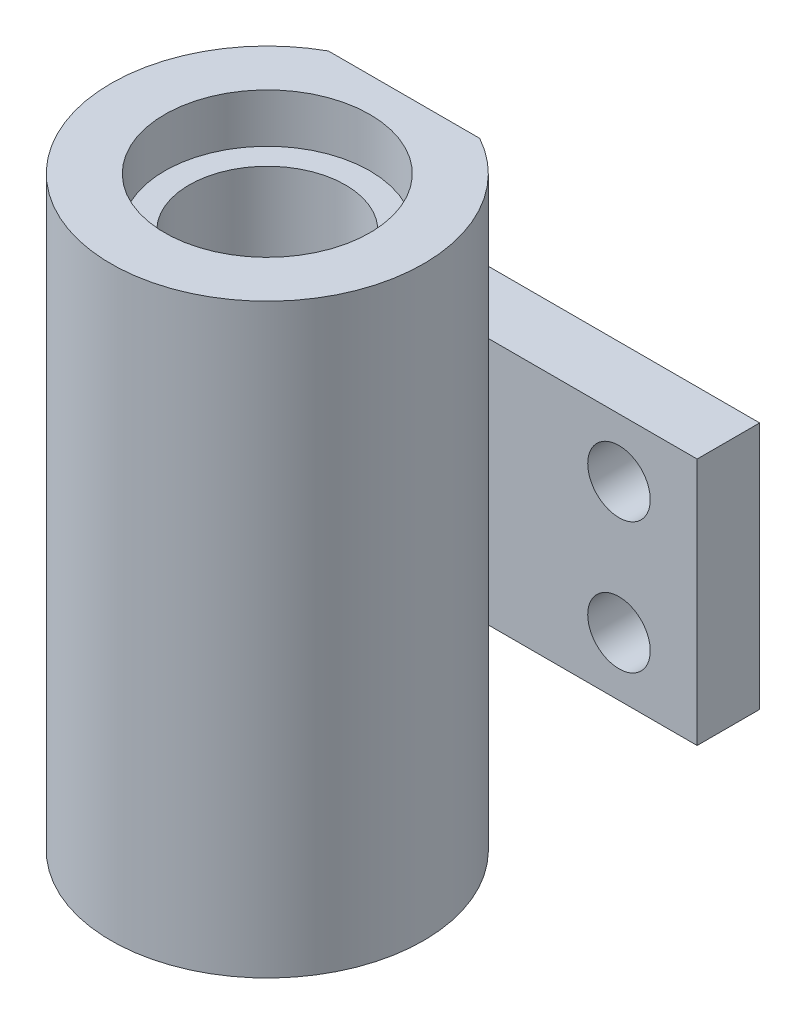
ISO-10303-21;
HEADER;
FILE_DESCRIPTION(('STEP AP214'),'2;1');
FILE_NAME('part.step','',(''),(''),'','','');
FILE_SCHEMA(('AUTOMOTIVE_DESIGN { 1 0 10303 214 1 1 1 1 }'));
ENDSEC;
DATA;
#1=APPLICATION_CONTEXT('core data for automotive mechanical design processes');
#2=APPLICATION_PROTOCOL_DEFINITION('international standard','automotive_design',2000,#1);
#3=PRODUCT_CONTEXT('',#1,'mechanical');
#4=PRODUCT('Part','Part','',(#3));
#5=PRODUCT_RELATED_PRODUCT_CATEGORY('part','',(#4));
#6=PRODUCT_DEFINITION_FORMATION('','',#4);
#7=PRODUCT_DEFINITION_CONTEXT('part definition',#1,'design');
#8=PRODUCT_DEFINITION('design','',#6,#7);
#9=PRODUCT_DEFINITION_SHAPE('','',#8);
#10=(LENGTH_UNIT() NAMED_UNIT(*) SI_UNIT(.MILLI.,.METRE.));
#11=(NAMED_UNIT(*) PLANE_ANGLE_UNIT() SI_UNIT($,.RADIAN.));
#12=(NAMED_UNIT(*) SI_UNIT($,.STERADIAN.) SOLID_ANGLE_UNIT());
#13=UNCERTAINTY_MEASURE_WITH_UNIT(LENGTH_MEASURE(1.E-05),#10,'distance_accuracy_value','');
#14=(GEOMETRIC_REPRESENTATION_CONTEXT(3) GLOBAL_UNCERTAINTY_ASSIGNED_CONTEXT((#13)) GLOBAL_UNIT_ASSIGNED_CONTEXT((#10,
#11,#12)) REPRESENTATION_CONTEXT('',''));
#15=CARTESIAN_POINT('',(0.,0.,0.));
#16=DIRECTION('',(0.,0.,1.));
#17=DIRECTION('',(1.,0.,0.));
#18=AXIS2_PLACEMENT_3D('',#15,#16,#17);
#19=CARTESIAN_POINT('',(-15.,64.,-14.));
#20=DIRECTION('',(0.,0.,1.));
#21=DIRECTION('',(1.,0.,0.));
#22=AXIS2_PLACEMENT_3D('',#19,#20,#21);
#23=PLANE('',#22);
#24=DIRECTION('',(1.,0.,0.));
#25=VECTOR('',#24,1.);
#26=CARTESIAN_POINT('',(-15.,42.7,-14.));
#27=LINE('',#26,#25);
#28=CARTESIAN_POINT('',(-7.74596669241483,42.7,-14.));
#29=VERTEX_POINT('',#28);
#30=CARTESIAN_POINT('',(7.74596669241483,42.7,-14.));
#31=VERTEX_POINT('',#30);
#32=EDGE_CURVE('E11',#29,#31,#27,.T.);
#33=ORIENTED_EDGE('',*,*,#32,.F.);
#34=DIRECTION('',(0.,-1.,0.));
#35=VECTOR('',#34,1.);
#36=CARTESIAN_POINT('',(-7.74596669241483,0.,-14.));
#37=LINE('',#36,#35);
#38=CARTESIAN_POINT('',(-7.74596669241483,60.,-14.));
#39=VERTEX_POINT('',#38);
#40=EDGE_CURVE('E136',#39,#29,#37,.T.);
#41=ORIENTED_EDGE('',*,*,#40,.F.);
#42=DIRECTION('',(-1.,0.,0.));
#43=VECTOR('',#42,1.);
#44=CARTESIAN_POINT('',(-10.5,60.,-14.));
#45=LINE('',#44,#43);
#46=CARTESIAN_POINT('',(7.74596669241483,60.,-14.));
#47=VERTEX_POINT('',#46);
#48=EDGE_CURVE('E132',#47,#39,#45,.T.);
#49=ORIENTED_EDGE('',*,*,#48,.F.);
#50=DIRECTION('',(0.,-1.,0.));
#51=VECTOR('',#50,1.);
#52=CARTESIAN_POINT('',(7.74596669241483,0.,-14.));
#53=LINE('',#52,#51);
#54=EDGE_CURVE('E52',#31,#47,#53,.F.);
#55=ORIENTED_EDGE('',*,*,#54,.F.);
#56=EDGE_LOOP('',(#33,#41,#49,#55));
#57=FACE_BOUND('',#56,.T.);
#58=ADVANCED_FACE('F34',(#57),#23,.F.);
#59=DIRECTION('',(-1.,0.,0.));
#60=VECTOR('',#59,1.);
#61=CARTESIAN_POINT('',(-15.,17.3,-14.));
#62=LINE('',#61,#60);
#63=CARTESIAN_POINT('',(7.74596669241483,17.3,-14.));
#64=VERTEX_POINT('',#63);
#65=CARTESIAN_POINT('',(-7.74596669241483,17.3,-14.));
#66=VERTEX_POINT('',#65);
#67=EDGE_CURVE('E42',#64,#66,#62,.T.);
#68=ORIENTED_EDGE('',*,*,#67,.F.);
#69=CARTESIAN_POINT('',(7.74596669241482,0.,-14.));
#70=VERTEX_POINT('',#69);
#71=EDGE_CURVE('E126',#70,#64,#53,.F.);
#72=ORIENTED_EDGE('',*,*,#71,.F.);
#73=DIRECTION('',(1.,0.,0.));
#74=VECTOR('',#73,1.);
#75=CARTESIAN_POINT('',(-16.,0.,-14.));
#76=LINE('',#75,#74);
#77=CARTESIAN_POINT('',(-7.74596669241482,0.,-14.));
#78=VERTEX_POINT('',#77);
#79=EDGE_CURVE('E163',#78,#70,#76,.T.);
#80=ORIENTED_EDGE('',*,*,#79,.F.);
#81=EDGE_CURVE('E135',#66,#78,#37,.T.);
#82=ORIENTED_EDGE('',*,*,#81,.F.);
#83=EDGE_LOOP('',(#68,#72,#80,#82));
#84=FACE_BOUND('',#83,.T.);
#85=ADVANCED_FACE('F175',(#84),#23,.F.);
#86=CARTESIAN_POINT('',(0.,0.,0.));
#87=DIRECTION('',(0.,-1.,0.));
#88=DIRECTION('',(0.,0.,-1.));
#89=AXIS2_PLACEMENT_3D('',#86,#87,#88);
#90=CYLINDRICAL_SURFACE('',#89,8.);
#91=CARTESIAN_POINT('',(0.,55.,0.));
#92=DIRECTION('',(0.,-1.,0.));
#93=DIRECTION('',(0.,0.,-1.));
#94=AXIS2_PLACEMENT_3D('',#91,#92,#93);
#95=CIRCLE('',#94,8.);
#96=CARTESIAN_POINT('',(0.,55.,-8.));
#97=VERTEX_POINT('',#96);
#98=EDGE_CURVE('E160',#97,#97,#95,.T.);
#99=ORIENTED_EDGE('',*,*,#98,.F.);
#100=EDGE_LOOP('',(#99));
#101=FACE_BOUND('',#100,.T.);
#102=CARTESIAN_POINT('',(0.,5.,0.));
#103=DIRECTION('',(0.,-1.,0.));
#104=DIRECTION('',(0.,0.,-1.));
#105=AXIS2_PLACEMENT_3D('',#102,#103,#104);
#106=CIRCLE('',#105,8.);
#107=CARTESIAN_POINT('',(0.,5.,-8.));
#108=VERTEX_POINT('',#107);
#109=EDGE_CURVE('E138',#108,#108,#106,.T.);
#110=ORIENTED_EDGE('',*,*,#109,.T.);
#111=EDGE_LOOP('',(#110));
#112=FACE_BOUND('',#111,.T.);
#113=ADVANCED_FACE('F36',(#101,#112),#90,.F.);
#114=CARTESIAN_POINT('',(-8.,55.,0.));
#115=DIRECTION('',(0.,-1.,0.));
#116=DIRECTION('',(0.,0.,-1.));
#117=AXIS2_PLACEMENT_3D('',#114,#115,#116);
#118=PLANE('',#117);
#119=CARTESIAN_POINT('',(0.,55.,0.));
#120=DIRECTION('',(0.,-1.,0.));
#121=DIRECTION('',(0.,0.,-1.));
#122=AXIS2_PLACEMENT_3D('',#119,#120,#121);
#123=CIRCLE('',#122,10.5);
#124=CARTESIAN_POINT('',(0.,55.,-10.5));
#125=VERTEX_POINT('',#124);
#126=EDGE_CURVE('E157',#125,#125,#123,.T.);
#127=ORIENTED_EDGE('',*,*,#126,.F.);
#128=EDGE_LOOP('',(#127));
#129=FACE_BOUND('',#128,.T.);
#130=ORIENTED_EDGE('',*,*,#98,.T.);
#131=EDGE_LOOP('',(#130));
#132=FACE_BOUND('',#131,.T.);
#133=ADVANCED_FACE('F268',(#129,#132),#118,.F.);
#134=CARTESIAN_POINT('',(0.,0.,0.));
#135=DIRECTION('',(0.,-1.,0.));
#136=DIRECTION('',(0.,0.,-1.));
#137=AXIS2_PLACEMENT_3D('',#134,#135,#136);
#138=CYLINDRICAL_SURFACE('',#137,10.5);
#139=CARTESIAN_POINT('',(0.,60.,0.));
#140=DIRECTION('',(0.,-1.,0.));
#141=DIRECTION('',(0.,0.,-1.));
#142=AXIS2_PLACEMENT_3D('',#139,#140,#141);
#143=CIRCLE('',#142,10.5);
#144=CARTESIAN_POINT('',(0.,60.,-10.5));
#145=VERTEX_POINT('',#144);
#146=EDGE_CURVE('E154',#145,#145,#143,.T.);
#147=ORIENTED_EDGE('',*,*,#146,.F.);
#148=EDGE_LOOP('',(#147));
#149=FACE_BOUND('',#148,.T.);
#150=ORIENTED_EDGE('',*,*,#126,.T.);
#151=EDGE_LOOP('',(#150));
#152=FACE_BOUND('',#151,.T.);
#153=ADVANCED_FACE('F265',(#149,#152),#138,.F.);
#154=CARTESIAN_POINT('',(-10.5,60.,0.));
#155=DIRECTION('',(0.,-1.,0.));
#156=DIRECTION('',(0.,0.,-1.));
#157=AXIS2_PLACEMENT_3D('',#154,#155,#156);
#158=PLANE('',#157);
#159=CARTESIAN_POINT('',(0.,60.,0.));
#160=DIRECTION('',(0.,-1.,0.));
#161=DIRECTION('',(0.,0.,-1.));
#162=AXIS2_PLACEMENT_3D('',#159,#160,#161);
#163=CIRCLE('',#162,16.);
#164=EDGE_CURVE('E151',#47,#39,#163,.T.);
#165=ORIENTED_EDGE('',*,*,#164,.F.);
#166=ORIENTED_EDGE('',*,*,#48,.T.);
#167=EDGE_LOOP('',(#165,#166));
#168=FACE_BOUND('',#167,.T.);
#169=ORIENTED_EDGE('',*,*,#146,.T.);
#170=EDGE_LOOP('',(#169));
#171=FACE_BOUND('',#170,.T.);
#172=ADVANCED_FACE('F262',(#168,#171),#158,.F.);
#173=CARTESIAN_POINT('',(0.,0.,0.));
#174=DIRECTION('',(0.,-1.,0.));
#175=DIRECTION('',(0.,0.,-1.));
#176=AXIS2_PLACEMENT_3D('',#173,#174,#175);
#177=CYLINDRICAL_SURFACE('',#176,16.);
#178=ORIENTED_EDGE('',*,*,#164,.T.);
#179=ORIENTED_EDGE('',*,*,#40,.T.);
#180=EDGE_CURVE('E139',#29,#66,#37,.T.);
#181=ORIENTED_EDGE('',*,*,#180,.T.);
#182=ORIENTED_EDGE('',*,*,#81,.T.);
#183=CARTESIAN_POINT('',(0.,0.,0.));
#184=DIRECTION('',(0.,-1.,0.));
#185=DIRECTION('',(0.,0.,-1.));
#186=AXIS2_PLACEMENT_3D('',#183,#184,#185);
#187=CIRCLE('',#186,16.);
#188=EDGE_CURVE('E148',#70,#78,#187,.T.);
#189=ORIENTED_EDGE('',*,*,#188,.F.);
#190=ORIENTED_EDGE('',*,*,#71,.T.);
#191=EDGE_CURVE('E124',#64,#31,#53,.F.);
#192=ORIENTED_EDGE('',*,*,#191,.T.);
#193=ORIENTED_EDGE('',*,*,#54,.T.);
#194=EDGE_LOOP('',(#178,#179,#181,#182,#189,#190,#192,#193));
#195=FACE_BOUND('',#194,.T.);
#196=ADVANCED_FACE('F180',(#195),#177,.T.);
#197=CARTESIAN_POINT('',(-16.,0.,0.));
#198=DIRECTION('',(0.,1.,0.));
#199=DIRECTION('',(0.,0.,1.));
#200=AXIS2_PLACEMENT_3D('',#197,#198,#199);
#201=PLANE('',#200);
#202=CARTESIAN_POINT('',(0.,0.,0.));
#203=DIRECTION('',(0.,-1.,0.));
#204=DIRECTION('',(0.,0.,-1.));
#205=AXIS2_PLACEMENT_3D('',#202,#203,#204);
#206=CIRCLE('',#205,10.5);
#207=CARTESIAN_POINT('',(0.,0.,-10.5));
#208=VERTEX_POINT('',#207);
#209=EDGE_CURVE('E145',#208,#208,#206,.T.);
#210=ORIENTED_EDGE('',*,*,#209,.F.);
#211=EDGE_LOOP('',(#210));
#212=FACE_BOUND('',#211,.T.);
#213=ORIENTED_EDGE('',*,*,#188,.T.);
#214=ORIENTED_EDGE('',*,*,#79,.T.);
#215=EDGE_LOOP('',(#213,#214));
#216=FACE_BOUND('',#215,.T.);
#217=ADVANCED_FACE('F255',(#212,#216),#201,.F.);
#218=CARTESIAN_POINT('',(0.,0.,0.));
#219=DIRECTION('',(0.,-1.,0.));
#220=DIRECTION('',(0.,0.,-1.));
#221=AXIS2_PLACEMENT_3D('',#218,#219,#220);
#222=CYLINDRICAL_SURFACE('',#221,10.5);
#223=CARTESIAN_POINT('',(0.,5.,0.));
#224=DIRECTION('',(0.,-1.,0.));
#225=DIRECTION('',(0.,0.,-1.));
#226=AXIS2_PLACEMENT_3D('',#223,#224,#225);
#227=CIRCLE('',#226,10.5);
#228=CARTESIAN_POINT('',(0.,5.,-10.5));
#229=VERTEX_POINT('',#228);
#230=EDGE_CURVE('E142',#229,#229,#227,.T.);
#231=ORIENTED_EDGE('',*,*,#230,.F.);
#232=EDGE_LOOP('',(#231));
#233=FACE_BOUND('',#232,.T.);
#234=ORIENTED_EDGE('',*,*,#209,.T.);
#235=EDGE_LOOP('',(#234));
#236=FACE_BOUND('',#235,.T.);
#237=ADVANCED_FACE('F251',(#233,#236),#222,.F.);
#238=CARTESIAN_POINT('',(-10.5,5.,0.));
#239=DIRECTION('',(0.,1.,0.));
#240=DIRECTION('',(0.,0.,1.));
#241=AXIS2_PLACEMENT_3D('',#238,#239,#240);
#242=PLANE('',#241);
#243=ORIENTED_EDGE('',*,*,#109,.F.);
#244=EDGE_LOOP('',(#243));
#245=FACE_BOUND('',#244,.T.);
#246=ORIENTED_EDGE('',*,*,#230,.T.);
#247=EDGE_LOOP('',(#246));
#248=FACE_BOUND('',#247,.T.);
#249=ADVANCED_FACE('F248',(#245,#248),#242,.F.);
#250=CARTESIAN_POINT('',(0.,0.,-14.));
#251=DIRECTION('',(0.,0.,1.));
#252=DIRECTION('',(1.,0.,0.));
#253=AXIS2_PLACEMENT_3D('',#250,#251,#252);
#254=PLANE('',#253);
#255=CARTESIAN_POINT('',(-22.,23.3,-14.));
#256=DIRECTION('',(0.,0.,-1.));
#257=DIRECTION('',(-1.,0.,0.));
#258=AXIS2_PLACEMENT_3D('',#255,#256,#257);
#259=CIRCLE('',#258,3.2);
#260=CARTESIAN_POINT('',(-25.2,23.3,-14.));
#261=VERTEX_POINT('',#260);
#262=EDGE_CURVE('E221',#261,#261,#259,.T.);
#263=ORIENTED_EDGE('',*,*,#262,.T.);
#264=EDGE_LOOP('',(#263));
#265=FACE_BOUND('',#264,.T.);
#266=CARTESIAN_POINT('',(-22.,36.7,-14.));
#267=DIRECTION('',(0.,0.,-1.));
#268=DIRECTION('',(-1.,0.,0.));
#269=AXIS2_PLACEMENT_3D('',#266,#267,#268);
#270=CIRCLE('',#269,3.2);
#271=CARTESIAN_POINT('',(-25.2,36.7,-14.));
#272=VERTEX_POINT('',#271);
#273=EDGE_CURVE('E215',#272,#272,#270,.T.);
#274=ORIENTED_EDGE('',*,*,#273,.T.);
#275=EDGE_LOOP('',(#274));
#276=FACE_BOUND('',#275,.T.);
#277=ORIENTED_EDGE('',*,*,#180,.F.);
#278=DIRECTION('',(1.,0.,0.));
#279=VECTOR('',#278,1.);
#280=CARTESIAN_POINT('',(30.,42.7,-14.));
#281=LINE('',#280,#279);
#282=CARTESIAN_POINT('',(-30.,42.7,-14.));
#283=VERTEX_POINT('',#282);
#284=EDGE_CURVE('E187',#283,#29,#281,.T.);
#285=ORIENTED_EDGE('',*,*,#284,.F.);
#286=DIRECTION('',(0.,1.,0.));
#287=VECTOR('',#286,1.);
#288=CARTESIAN_POINT('',(-30.,17.3,-14.));
#289=LINE('',#288,#287);
#290=CARTESIAN_POINT('',(-30.,17.3,-14.));
#291=VERTEX_POINT('',#290);
#292=EDGE_CURVE('E122',#291,#283,#289,.T.);
#293=ORIENTED_EDGE('',*,*,#292,.F.);
#294=DIRECTION('',(-1.,0.,0.));
#295=VECTOR('',#294,1.);
#296=CARTESIAN_POINT('',(30.,17.3,-14.));
#297=LINE('',#296,#295);
#298=EDGE_CURVE('E170',#66,#291,#297,.T.);
#299=ORIENTED_EDGE('',*,*,#298,.F.);
#300=EDGE_LOOP('',(#277,#285,#293,#299));
#301=FACE_BOUND('',#300,.T.);
#302=ADVANCED_FACE('F237',(#265,#276,#301),#254,.T.);
#303=CARTESIAN_POINT('',(22.,23.3,-14.));
#304=DIRECTION('',(0.,0.,-1.));
#305=DIRECTION('',(-1.,0.,0.));
#306=AXIS2_PLACEMENT_3D('',#303,#304,#305);
#307=CIRCLE('',#306,3.2);
#308=CARTESIAN_POINT('',(18.8,23.3,-14.));
#309=VERTEX_POINT('',#308);
#310=EDGE_CURVE('E209',#309,#309,#307,.T.);
#311=ORIENTED_EDGE('',*,*,#310,.T.);
#312=EDGE_LOOP('',(#311));
#313=FACE_BOUND('',#312,.T.);
#314=CARTESIAN_POINT('',(22.,36.7,-14.));
#315=DIRECTION('',(0.,0.,-1.));
#316=DIRECTION('',(-1.,0.,0.));
#317=AXIS2_PLACEMENT_3D('',#314,#315,#316);
#318=CIRCLE('',#317,3.2);
#319=CARTESIAN_POINT('',(18.8,36.7,-14.));
#320=VERTEX_POINT('',#319);
#321=EDGE_CURVE('E202',#320,#320,#318,.T.);
#322=ORIENTED_EDGE('',*,*,#321,.T.);
#323=EDGE_LOOP('',(#322));
#324=FACE_BOUND('',#323,.T.);
#325=ORIENTED_EDGE('',*,*,#191,.F.);
#326=CARTESIAN_POINT('',(30.,17.3,-14.));
#327=VERTEX_POINT('',#326);
#328=EDGE_CURVE('E118',#327,#64,#297,.T.);
#329=ORIENTED_EDGE('',*,*,#328,.F.);
#330=DIRECTION('',(0.,-1.,0.));
#331=VECTOR('',#330,1.);
#332=CARTESIAN_POINT('',(30.,17.3,-14.));
#333=LINE('',#332,#331);
#334=CARTESIAN_POINT('',(30.,42.7,-14.));
#335=VERTEX_POINT('',#334);
#336=EDGE_CURVE('E186',#335,#327,#333,.T.);
#337=ORIENTED_EDGE('',*,*,#336,.F.);
#338=EDGE_CURVE('E185',#31,#335,#281,.T.);
#339=ORIENTED_EDGE('',*,*,#338,.F.);
#340=EDGE_LOOP('',(#325,#329,#337,#339));
#341=FACE_BOUND('',#340,.T.);
#342=ADVANCED_FACE('F183',(#313,#324,#341),#254,.T.);
#343=CARTESIAN_POINT('',(0.,0.,-20.4));
#344=DIRECTION('',(0.,0.,1.));
#345=DIRECTION('',(1.,0.,0.));
#346=AXIS2_PLACEMENT_3D('',#343,#344,#345);
#347=PLANE('',#346);
#348=DIRECTION('',(0.,1.,0.));
#349=VECTOR('',#348,1.);
#350=CARTESIAN_POINT('',(-30.,17.3,-20.4));
#351=LINE('',#350,#349);
#352=CARTESIAN_POINT('',(-30.,17.3,-20.4));
#353=VERTEX_POINT('',#352);
#354=CARTESIAN_POINT('',(-30.,42.7,-20.4));
#355=VERTEX_POINT('',#354);
#356=EDGE_CURVE('E108',#353,#355,#351,.T.);
#357=ORIENTED_EDGE('',*,*,#356,.T.);
#358=DIRECTION('',(1.,0.,0.));
#359=VECTOR('',#358,1.);
#360=CARTESIAN_POINT('',(30.,42.7,-20.4));
#361=LINE('',#360,#359);
#362=CARTESIAN_POINT('',(30.,42.7,-20.4));
#363=VERTEX_POINT('',#362);
#364=EDGE_CURVE('E96',#355,#363,#361,.T.);
#365=ORIENTED_EDGE('',*,*,#364,.T.);
#366=DIRECTION('',(0.,-1.,0.));
#367=VECTOR('',#366,1.);
#368=CARTESIAN_POINT('',(30.,17.3,-20.4));
#369=LINE('',#368,#367);
#370=CARTESIAN_POINT('',(30.,17.3,-20.4));
#371=VERTEX_POINT('',#370);
#372=EDGE_CURVE('E107',#363,#371,#369,.T.);
#373=ORIENTED_EDGE('',*,*,#372,.T.);
#374=DIRECTION('',(-1.,0.,0.));
#375=VECTOR('',#374,1.);
#376=CARTESIAN_POINT('',(30.,17.3,-20.4));
#377=LINE('',#376,#375);
#378=EDGE_CURVE('E114',#371,#353,#377,.T.);
#379=ORIENTED_EDGE('',*,*,#378,.T.);
#380=EDGE_LOOP('',(#357,#365,#373,#379));
#381=FACE_BOUND('',#380,.T.);
#382=CARTESIAN_POINT('',(22.,36.7,-20.4));
#383=DIRECTION('',(0.,0.,-1.));
#384=DIRECTION('',(-1.,0.,0.));
#385=AXIS2_PLACEMENT_3D('',#382,#383,#384);
#386=CIRCLE('',#385,3.2);
#387=CARTESIAN_POINT('',(18.8,36.7,-20.4));
#388=VERTEX_POINT('',#387);
#389=EDGE_CURVE('E205',#388,#388,#386,.T.);
#390=ORIENTED_EDGE('',*,*,#389,.F.);
#391=EDGE_LOOP('',(#390));
#392=FACE_BOUND('',#391,.T.);
#393=CARTESIAN_POINT('',(22.,23.3,-20.4));
#394=DIRECTION('',(0.,0.,-1.));
#395=DIRECTION('',(-1.,0.,0.));
#396=AXIS2_PLACEMENT_3D('',#393,#394,#395);
#397=CIRCLE('',#396,3.2);
#398=CARTESIAN_POINT('',(18.8,23.3,-20.4));
#399=VERTEX_POINT('',#398);
#400=EDGE_CURVE('E206',#399,#399,#397,.T.);
#401=ORIENTED_EDGE('',*,*,#400,.F.);
#402=EDGE_LOOP('',(#401));
#403=FACE_BOUND('',#402,.T.);
#404=CARTESIAN_POINT('',(-22.,36.7,-20.4));
#405=DIRECTION('',(0.,0.,-1.));
#406=DIRECTION('',(-1.,0.,0.));
#407=AXIS2_PLACEMENT_3D('',#404,#405,#406);
#408=CIRCLE('',#407,3.2);
#409=CARTESIAN_POINT('',(-25.2,36.7,-20.4));
#410=VERTEX_POINT('',#409);
#411=EDGE_CURVE('E212',#410,#410,#408,.T.);
#412=ORIENTED_EDGE('',*,*,#411,.F.);
#413=EDGE_LOOP('',(#412));
#414=FACE_BOUND('',#413,.T.);
#415=CARTESIAN_POINT('',(-22.,23.3,-20.4));
#416=DIRECTION('',(0.,0.,-1.));
#417=DIRECTION('',(-1.,0.,0.));
#418=AXIS2_PLACEMENT_3D('',#415,#416,#417);
#419=CIRCLE('',#418,3.2);
#420=CARTESIAN_POINT('',(-25.2,23.3,-20.4));
#421=VERTEX_POINT('',#420);
#422=EDGE_CURVE('E218',#421,#421,#419,.T.);
#423=ORIENTED_EDGE('',*,*,#422,.F.);
#424=EDGE_LOOP('',(#423));
#425=FACE_BOUND('',#424,.T.);
#426=ADVANCED_FACE('F111',(#381,#392,#403,#414,#425),#347,.F.);
#427=CARTESIAN_POINT('',(-30.,17.3,-20.4));
#428=DIRECTION('',(1.,0.,0.));
#429=DIRECTION('',(0.,0.,-1.));
#430=AXIS2_PLACEMENT_3D('',#427,#428,#429);
#431=PLANE('',#430);
#432=ORIENTED_EDGE('',*,*,#292,.T.);
#433=DIRECTION('',(0.,0.,1.));
#434=VECTOR('',#433,1.);
#435=CARTESIAN_POINT('',(-30.,42.7,-20.4));
#436=LINE('',#435,#434);
#437=EDGE_CURVE('E101',#355,#283,#436,.T.);
#438=ORIENTED_EDGE('',*,*,#437,.F.);
#439=ORIENTED_EDGE('',*,*,#356,.F.);
#440=DIRECTION('',(0.,0.,1.));
#441=VECTOR('',#440,1.);
#442=CARTESIAN_POINT('',(-30.,17.3,-20.4));
#443=LINE('',#442,#441);
#444=EDGE_CURVE('E196',#353,#291,#443,.T.);
#445=ORIENTED_EDGE('',*,*,#444,.T.);
#446=EDGE_LOOP('',(#432,#438,#439,#445));
#447=FACE_BOUND('',#446,.T.);
#448=ADVANCED_FACE('F120',(#447),#431,.F.);
#449=CARTESIAN_POINT('',(30.,42.7,-20.4));
#450=DIRECTION('',(0.,-1.,0.));
#451=DIRECTION('',(0.,0.,-1.));
#452=AXIS2_PLACEMENT_3D('',#449,#450,#451);
#453=PLANE('',#452);
#454=ORIENTED_EDGE('',*,*,#284,.T.);
#455=ORIENTED_EDGE('',*,*,#32,.T.);
#456=ORIENTED_EDGE('',*,*,#338,.T.);
#457=DIRECTION('',(0.,0.,1.));
#458=VECTOR('',#457,1.);
#459=CARTESIAN_POINT('',(30.,42.7,-20.4));
#460=LINE('',#459,#458);
#461=EDGE_CURVE('E104',#363,#335,#460,.T.);
#462=ORIENTED_EDGE('',*,*,#461,.F.);
#463=ORIENTED_EDGE('',*,*,#364,.F.);
#464=ORIENTED_EDGE('',*,*,#437,.T.);
#465=EDGE_LOOP('',(#454,#455,#456,#462,#463,#464));
#466=FACE_BOUND('',#465,.T.);
#467=ADVANCED_FACE('F99',(#466),#453,.F.);
#468=CARTESIAN_POINT('',(30.,17.3,-20.4));
#469=DIRECTION('',(-1.,0.,0.));
#470=DIRECTION('',(0.,0.,1.));
#471=AXIS2_PLACEMENT_3D('',#468,#469,#470);
#472=PLANE('',#471);
#473=ORIENTED_EDGE('',*,*,#336,.T.);
#474=DIRECTION('',(0.,0.,1.));
#475=VECTOR('',#474,1.);
#476=CARTESIAN_POINT('',(30.,17.3,-20.4));
#477=LINE('',#476,#475);
#478=EDGE_CURVE('E127',#371,#327,#477,.T.);
#479=ORIENTED_EDGE('',*,*,#478,.F.);
#480=ORIENTED_EDGE('',*,*,#372,.F.);
#481=ORIENTED_EDGE('',*,*,#461,.T.);
#482=EDGE_LOOP('',(#473,#479,#480,#481));
#483=FACE_BOUND('',#482,.T.);
#484=ADVANCED_FACE('F199',(#483),#472,.F.);
#485=CARTESIAN_POINT('',(30.,17.3,-20.4));
#486=DIRECTION('',(0.,1.,0.));
#487=DIRECTION('',(0.,0.,1.));
#488=AXIS2_PLACEMENT_3D('',#485,#486,#487);
#489=PLANE('',#488);
#490=ORIENTED_EDGE('',*,*,#328,.T.);
#491=ORIENTED_EDGE('',*,*,#67,.T.);
#492=ORIENTED_EDGE('',*,*,#298,.T.);
#493=ORIENTED_EDGE('',*,*,#444,.F.);
#494=ORIENTED_EDGE('',*,*,#378,.F.);
#495=ORIENTED_EDGE('',*,*,#478,.T.);
#496=EDGE_LOOP('',(#490,#491,#492,#493,#494,#495));
#497=FACE_BOUND('',#496,.T.);
#498=ADVANCED_FACE('F168',(#497),#489,.F.);
#499=CARTESIAN_POINT('',(22.,36.7,-20.4));
#500=DIRECTION('',(0.,0.,1.));
#501=DIRECTION('',(1.,0.,0.));
#502=AXIS2_PLACEMENT_3D('',#499,#500,#501);
#503=CYLINDRICAL_SURFACE('',#502,3.2);
#504=ORIENTED_EDGE('',*,*,#389,.T.);
#505=EDGE_LOOP('',(#504));
#506=FACE_BOUND('',#505,.T.);
#507=ORIENTED_EDGE('',*,*,#321,.F.);
#508=EDGE_LOOP('',(#507));
#509=FACE_BOUND('',#508,.T.);
#510=ADVANCED_FACE('F353',(#506,#509),#503,.F.);
#511=CARTESIAN_POINT('',(22.,23.3,-20.4));
#512=DIRECTION('',(0.,0.,1.));
#513=DIRECTION('',(1.,0.,0.));
#514=AXIS2_PLACEMENT_3D('',#511,#512,#513);
#515=CYLINDRICAL_SURFACE('',#514,3.2);
#516=ORIENTED_EDGE('',*,*,#400,.T.);
#517=EDGE_LOOP('',(#516));
#518=FACE_BOUND('',#517,.T.);
#519=ORIENTED_EDGE('',*,*,#310,.F.);
#520=EDGE_LOOP('',(#519));
#521=FACE_BOUND('',#520,.T.);
#522=ADVANCED_FACE('F362',(#518,#521),#515,.F.);
#523=CARTESIAN_POINT('',(-22.,36.7,-20.4));
#524=DIRECTION('',(0.,0.,1.));
#525=DIRECTION('',(1.,0.,0.));
#526=AXIS2_PLACEMENT_3D('',#523,#524,#525);
#527=CYLINDRICAL_SURFACE('',#526,3.2);
#528=ORIENTED_EDGE('',*,*,#411,.T.);
#529=EDGE_LOOP('',(#528));
#530=FACE_BOUND('',#529,.T.);
#531=ORIENTED_EDGE('',*,*,#273,.F.);
#532=EDGE_LOOP('',(#531));
#533=FACE_BOUND('',#532,.T.);
#534=ADVANCED_FACE('F371',(#530,#533),#527,.F.);
#535=CARTESIAN_POINT('',(-22.,23.3,-20.4));
#536=DIRECTION('',(0.,0.,1.));
#537=DIRECTION('',(1.,0.,0.));
#538=AXIS2_PLACEMENT_3D('',#535,#536,#537);
#539=CYLINDRICAL_SURFACE('',#538,3.2);
#540=ORIENTED_EDGE('',*,*,#422,.T.);
#541=EDGE_LOOP('',(#540));
#542=FACE_BOUND('',#541,.T.);
#543=ORIENTED_EDGE('',*,*,#262,.F.);
#544=EDGE_LOOP('',(#543));
#545=FACE_BOUND('',#544,.T.);
#546=ADVANCED_FACE('F227',(#542,#545),#539,.F.);
#547=CLOSED_SHELL('',(#58,#85,#113,#133,#153,#172,#196,#217,#237,#249,#302,#342,#426,#448,#467,
#484,#498,#510,#522,#534,#546));
#548=MANIFOLD_SOLID_BREP('B2',#547);
#549=ADVANCED_BREP_SHAPE_REPRESENTATION('',(#18,#548),#14);
#550=SHAPE_DEFINITION_REPRESENTATION(#9,#549);
ENDSEC;
END-ISO-10303-21;
